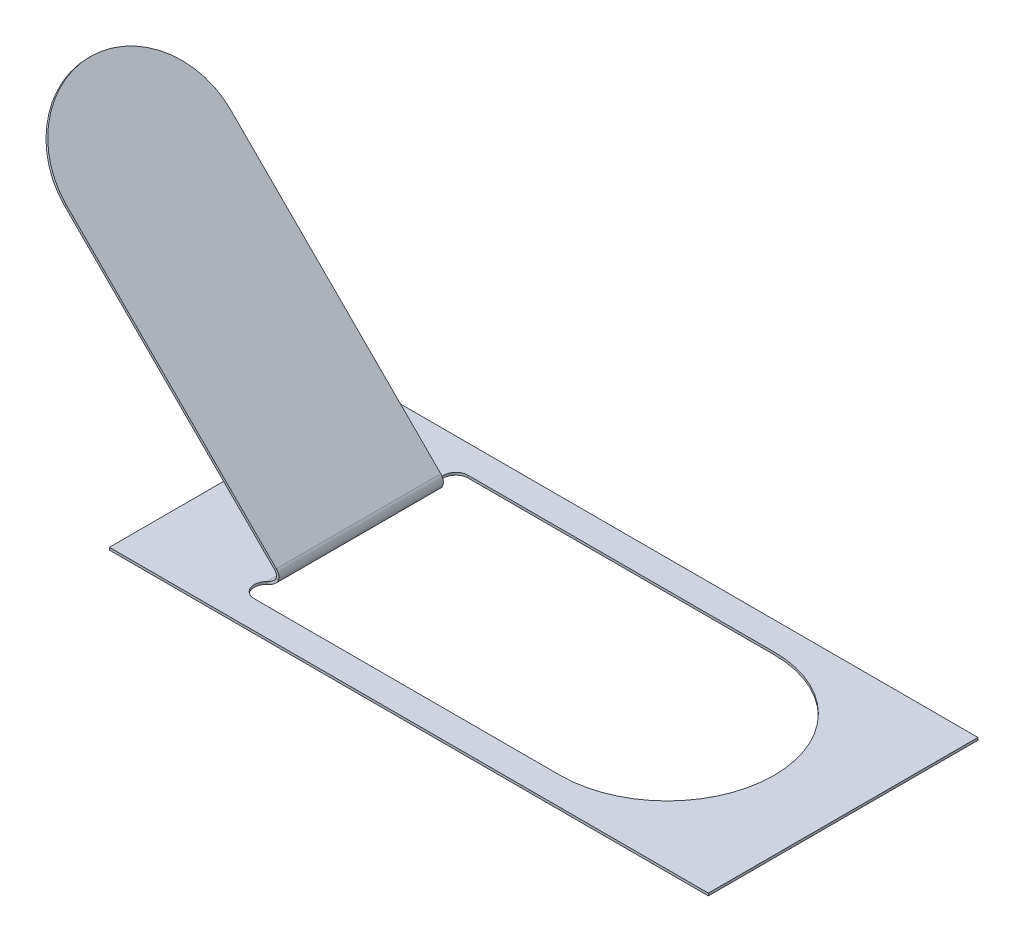
ISO-10303-21;
HEADER;
FILE_DESCRIPTION(('STEP AP214'),'2;1');
FILE_NAME('part.step','',(''),(''),'','','');
FILE_SCHEMA(('AUTOMOTIVE_DESIGN { 1 0 10303 214 1 1 1 1 }'));
ENDSEC;
DATA;
#1=APPLICATION_CONTEXT('core data for automotive mechanical design processes');
#2=APPLICATION_PROTOCOL_DEFINITION('international standard','automotive_design',2000,#1);
#3=PRODUCT_CONTEXT('',#1,'mechanical');
#4=PRODUCT('Part','Part','',(#3));
#5=PRODUCT_RELATED_PRODUCT_CATEGORY('part','',(#4));
#6=PRODUCT_DEFINITION_FORMATION('','',#4);
#7=PRODUCT_DEFINITION_CONTEXT('part definition',#1,'design');
#8=PRODUCT_DEFINITION('design','',#6,#7);
#9=PRODUCT_DEFINITION_SHAPE('','',#8);
#10=(LENGTH_UNIT() NAMED_UNIT(*) SI_UNIT(.MILLI.,.METRE.));
#11=(NAMED_UNIT(*) PLANE_ANGLE_UNIT() SI_UNIT($,.RADIAN.));
#12=(NAMED_UNIT(*) SI_UNIT($,.STERADIAN.) SOLID_ANGLE_UNIT());
#13=UNCERTAINTY_MEASURE_WITH_UNIT(LENGTH_MEASURE(1.E-05),#10,'distance_accuracy_value','');
#14=(GEOMETRIC_REPRESENTATION_CONTEXT(3) GLOBAL_UNCERTAINTY_ASSIGNED_CONTEXT((#13)) GLOBAL_UNIT_ASSIGNED_CONTEXT((#10,
#11,#12)) REPRESENTATION_CONTEXT('',''));
#15=CARTESIAN_POINT('',(0.,0.,0.));
#16=DIRECTION('',(0.,0.,1.));
#17=DIRECTION('',(1.,0.,0.));
#18=AXIS2_PLACEMENT_3D('',#15,#16,#17);
#19=CARTESIAN_POINT('',(-89.0509644783106,17.6776695296636,2.50000000000001));
#20=DIRECTION('',(0.923879532511288,-0.382683432365088,0.));
#21=DIRECTION('',(0.382683432365088,0.923879532511288,0.));
#22=AXIS2_PLACEMENT_3D('',#19,#20,#21);
#23=PLANE('',#22);
#24=DIRECTION('',(-0.382683432365088,-0.923879532511288,0.));
#25=VECTOR('',#24,1.);
#26=CARTESIAN_POINT('',(-89.0509644783106,17.6776695296636,-2.49999999999999));
#27=LINE('',#26,#25);
#28=CARTESIAN_POINT('',(-89.0509644783106,17.6776695296636,-2.49999999999999));
#29=VERTEX_POINT('',#28);
#30=CARTESIAN_POINT('',(-96.3732949486468,0.,-2.49999999999999));
#31=VERTEX_POINT('',#30);
#32=EDGE_CURVE('E134',#29,#31,#27,.T.);
#33=ORIENTED_EDGE('',*,*,#32,.T.);
#34=DIRECTION('',(0.,0.,-1.));
#35=VECTOR('',#34,1.);
#36=CARTESIAN_POINT('',(-96.3732949486468,0.,2.50000000000001));
#37=LINE('',#36,#35);
#38=CARTESIAN_POINT('',(-96.3732949486468,0.,2.50000000000001));
#39=VERTEX_POINT('',#38);
#40=EDGE_CURVE('E13',#39,#31,#37,.T.);
#41=ORIENTED_EDGE('',*,*,#40,.F.);
#42=DIRECTION('',(-0.382683432365088,-0.923879532511288,0.));
#43=VECTOR('',#42,1.);
#44=CARTESIAN_POINT('',(-89.0509644783106,17.6776695296636,2.50000000000001));
#45=LINE('',#44,#43);
#46=CARTESIAN_POINT('',(-89.0509644783106,17.6776695296636,2.50000000000001));
#47=VERTEX_POINT('',#46);
#48=EDGE_CURVE('E122',#47,#39,#45,.T.);
#49=ORIENTED_EDGE('',*,*,#48,.F.);
#50=DIRECTION('',(0.,0.,-1.));
#51=VECTOR('',#50,1.);
#52=CARTESIAN_POINT('',(-89.0509644783106,17.6776695296636,2.50000000000001));
#53=LINE('',#52,#51);
#54=EDGE_CURVE('E130',#47,#29,#53,.T.);
#55=ORIENTED_EDGE('',*,*,#54,.T.);
#56=EDGE_LOOP('',(#33,#41,#49,#55));
#57=FACE_BOUND('',#56,.T.);
#58=ADVANCED_FACE('F71',(#57),#23,.F.);
#59=CARTESIAN_POINT('',(-83.8732949486468,0.,2.50000000000001));
#60=DIRECTION('',(0.,1.,0.));
#61=DIRECTION('',(0.,0.,1.));
#62=AXIS2_PLACEMENT_3D('',#59,#60,#61);
#63=PLANE('',#62);
#64=DIRECTION('',(1.,0.,0.));
#65=VECTOR('',#64,1.);
#66=CARTESIAN_POINT('',(-83.8732949486468,0.,-2.49999999999999));
#67=LINE('',#66,#65);
#68=CARTESIAN_POINT('',(-83.8732949486468,0.,-2.49999999999999));
#69=VERTEX_POINT('',#68);
#70=EDGE_CURVE('E126',#31,#69,#67,.T.);
#71=ORIENTED_EDGE('',*,*,#70,.T.);
#72=DIRECTION('',(0.,0.,-1.));
#73=VECTOR('',#72,1.);
#74=CARTESIAN_POINT('',(-83.8732949486468,0.,2.50000000000001));
#75=LINE('',#74,#73);
#76=CARTESIAN_POINT('',(-83.8732949486468,0.,2.50000000000001));
#77=VERTEX_POINT('',#76);
#78=EDGE_CURVE('E79',#77,#69,#75,.T.);
#79=ORIENTED_EDGE('',*,*,#78,.F.);
#80=DIRECTION('',(1.,0.,0.));
#81=VECTOR('',#80,1.);
#82=CARTESIAN_POINT('',(-83.8732949486468,0.,2.50000000000001));
#83=LINE('',#82,#81);
#84=EDGE_CURVE('E117',#39,#77,#83,.T.);
#85=ORIENTED_EDGE('',*,*,#84,.F.);
#86=ORIENTED_EDGE('',*,*,#40,.T.);
#87=EDGE_LOOP('',(#71,#79,#85,#86));
#88=FACE_BOUND('',#87,.T.);
#89=ADVANCED_FACE('F125',(#88),#63,.F.);
#90=CARTESIAN_POINT('',(-80.2121297134787,8.83883476483179,2.50000000000001));
#91=DIRECTION('',(-0.923879532511288,0.382683432365087,0.));
#92=DIRECTION('',(-0.382683432365087,-0.923879532511288,0.));
#93=AXIS2_PLACEMENT_3D('',#90,#91,#92);
#94=PLANE('',#93);
#95=DIRECTION('',(0.382683432365087,0.923879532511288,0.));
#96=VECTOR('',#95,1.);
#97=CARTESIAN_POINT('',(-80.2121297134787,8.83883476483179,-2.49999999999999));
#98=LINE('',#97,#96);
#99=CARTESIAN_POINT('',(-80.2121297134787,8.83883476483179,-2.49999999999999));
#100=VERTEX_POINT('',#99);
#101=EDGE_CURVE('E104',#69,#100,#98,.T.);
#102=ORIENTED_EDGE('',*,*,#101,.T.);
#103=DIRECTION('',(0.,0.,-1.));
#104=VECTOR('',#103,1.);
#105=CARTESIAN_POINT('',(-80.2121297134787,8.83883476483179,2.50000000000001));
#106=LINE('',#105,#104);
#107=CARTESIAN_POINT('',(-80.2121297134787,8.83883476483179,2.50000000000001));
#108=VERTEX_POINT('',#107);
#109=EDGE_CURVE('E127',#108,#100,#106,.T.);
#110=ORIENTED_EDGE('',*,*,#109,.F.);
#111=DIRECTION('',(0.382683432365087,0.923879532511288,0.));
#112=VECTOR('',#111,1.);
#113=CARTESIAN_POINT('',(-80.2121297134787,8.83883476483179,2.50000000000001));
#114=LINE('',#113,#112);
#115=EDGE_CURVE('E120',#77,#108,#114,.T.);
#116=ORIENTED_EDGE('',*,*,#115,.F.);
#117=ORIENTED_EDGE('',*,*,#78,.T.);
#118=EDGE_LOOP('',(#102,#110,#116,#117));
#119=FACE_BOUND('',#118,.T.);
#120=ADVANCED_FACE('F128',(#119),#94,.F.);
#121=CARTESIAN_POINT('',(-80.2121297134787,8.83883476483179,2.50000000000001));
#122=DIRECTION('',(-0.707106781186544,-0.707106781186551,0.));
#123=DIRECTION('',(0.707106781186551,-0.707106781186544,0.));
#124=AXIS2_PLACEMENT_3D('',#121,#122,#123);
#125=PLANE('',#124);
#126=DIRECTION('',(-0.707106781186551,0.707106781186544,0.));
#127=VECTOR('',#126,1.);
#128=CARTESIAN_POINT('',(-80.2121297134787,8.83883476483179,-2.49999999999999));
#129=LINE('',#128,#127);
#130=EDGE_CURVE('E110',#100,#29,#129,.T.);
#131=ORIENTED_EDGE('',*,*,#130,.T.);
#132=ORIENTED_EDGE('',*,*,#54,.F.);
#133=DIRECTION('',(-0.707106781186551,0.707106781186544,0.));
#134=VECTOR('',#133,1.);
#135=CARTESIAN_POINT('',(-80.2121297134787,8.83883476483179,2.50000000000001));
#136=LINE('',#135,#134);
#137=EDGE_CURVE('E87',#108,#47,#136,.T.);
#138=ORIENTED_EDGE('',*,*,#137,.F.);
#139=ORIENTED_EDGE('',*,*,#109,.T.);
#140=EDGE_LOOP('',(#131,#132,#138,#139));
#141=FACE_BOUND('',#140,.T.);
#142=ADVANCED_FACE('F141',(#141),#125,.F.);
#143=CARTESIAN_POINT('',(0.,0.,2.50000000000001));
#144=DIRECTION('',(0.,0.,-1.));
#145=DIRECTION('',(-1.,0.,0.));
#146=AXIS2_PLACEMENT_3D('',#143,#144,#145);
#147=PLANE('',#146);
#148=ORIENTED_EDGE('',*,*,#48,.T.);
#149=ORIENTED_EDGE('',*,*,#84,.T.);
#150=ORIENTED_EDGE('',*,*,#115,.T.);
#151=ORIENTED_EDGE('',*,*,#137,.T.);
#152=EDGE_LOOP('',(#148,#149,#150,#151));
#153=FACE_BOUND('',#152,.T.);
#154=ADVANCED_FACE('F118',(#153),#147,.F.);
#155=CARTESIAN_POINT('',(0.,0.,-2.49999999999999));
#156=DIRECTION('',(0.,0.,-1.));
#157=DIRECTION('',(-1.,0.,0.));
#158=AXIS2_PLACEMENT_3D('',#155,#156,#157);
#159=PLANE('',#158);
#160=ORIENTED_EDGE('',*,*,#32,.F.);
#161=ORIENTED_EDGE('',*,*,#130,.F.);
#162=ORIENTED_EDGE('',*,*,#101,.F.);
#163=ORIENTED_EDGE('',*,*,#70,.F.);
#164=EDGE_LOOP('',(#160,#161,#162,#163));
#165=FACE_BOUND('',#164,.T.);
#166=ADVANCED_FACE('F144',(#165),#159,.T.);
#167=CLOSED_SHELL('',(#58,#89,#120,#142,#154,#166));
#168=MANIFOLD_SOLID_BREP('B2',#167);
#169=CARTESIAN_POINT('',(-66.0708724370337,8.83971311211782,-33.2923380798095));
#170=DIRECTION('',(0.,0.,1.));
#171=DIRECTION('',(-0.707106781186551,0.707106781186544,0.));
#172=AXIS2_PLACEMENT_3D('',#169,#170,#171);
#173=PLANE('',#172);
#174=DIRECTION('',(-0.707106781186551,0.707106781186544,0.));
#175=VECTOR('',#174,1.);
#176=CARTESIAN_POINT('',(-124.672019621781,54.7129382355066,-33.2923380798094));
#177=LINE('',#176,#175);
#178=CARTESIAN_POINT('',(-74.9339551204267,4.97487373415293,-33.2923380798095));
#179=VERTEX_POINT('',#178);
#180=CARTESIAN_POINT('',(-160.027358681108,90.0682772948338,-33.2923380798094));
#181=VERTEX_POINT('',#180);
#182=EDGE_CURVE('E198',#179,#181,#177,.T.);
#183=ORIENTED_EDGE('',*,*,#182,.F.);
#184=DIRECTION('',(-0.707106781186544,-0.707106781186551,0.));
#185=VECTOR('',#184,1.);
#186=CARTESIAN_POINT('',(-68.5699940897478,11.3388347648319,-33.2923380798095));
#187=LINE('',#186,#185);
#188=CARTESIAN_POINT('',(-75.6410619016132,4.26776695296637,-33.2923380798095));
#189=VERTEX_POINT('',#188);
#190=EDGE_CURVE('E69',#179,#189,#187,.T.);
#191=ORIENTED_EDGE('',*,*,#190,.T.);
#192=DIRECTION('',(-0.707106781186551,0.707106781186544,0.));
#193=VECTOR('',#192,1.);
#194=CARTESIAN_POINT('',(-73.1419402488991,1.76864530025231,-33.2923380798095));
#195=LINE('',#194,#193);
#196=CARTESIAN_POINT('',(-160.734465462295,89.3611705136473,-33.2923380798094));
#197=VERTEX_POINT('',#196);
#198=EDGE_CURVE('E535',#189,#197,#195,.T.);
#199=ORIENTED_EDGE('',*,*,#198,.T.);
#200=DIRECTION('',(-0.707106781186544,-0.707106781186551,0.));
#201=VECTOR('',#200,1.);
#202=CARTESIAN_POINT('',(-153.66339765043,96.4322383255128,-33.2923380798094));
#203=LINE('',#202,#201);
#204=EDGE_CURVE('E511',#181,#197,#203,.T.);
#205=ORIENTED_EDGE('',*,*,#204,.F.);
#206=EDGE_LOOP('',(#183,#191,#199,#205));
#207=FACE_BOUND('',#206,.T.);
#208=ADVANCED_FACE('F195',(#207),#173,.F.);
#209=CARTESIAN_POINT('',(-153.66339765043,96.4322383255128,33.2923380798095));
#210=DIRECTION('',(0.,0.,-1.));
#211=DIRECTION('',(0.707106781186551,-0.707106781186544,0.));
#212=AXIS2_PLACEMENT_3D('',#209,#210,#211);
#213=PLANE('',#212);
#214=DIRECTION('',(0.707106781186551,-0.707106781186544,0.));
#215=VECTOR('',#214,1.);
#216=CARTESIAN_POINT('',(-160.734465462295,89.3611705136472,33.2923380798095));
#217=LINE('',#216,#215);
#218=CARTESIAN_POINT('',(-160.734465462295,89.3611705136472,33.2923380798095));
#219=VERTEX_POINT('',#218);
#220=CARTESIAN_POINT('',(-75.6410619016132,4.26776695296637,33.2923380798095));
#221=VERTEX_POINT('',#220);
#222=EDGE_CURVE('E525',#219,#221,#217,.T.);
#223=ORIENTED_EDGE('',*,*,#222,.T.);
#224=DIRECTION('',(0.707106781186544,0.707106781186551,0.));
#225=VECTOR('',#224,1.);
#226=CARTESIAN_POINT('',(-68.5699940897478,11.3388347648319,33.2923380798095));
#227=LINE('',#226,#225);
#228=CARTESIAN_POINT('',(-74.9339551204267,4.97487373415292,33.2923380798095));
#229=VERTEX_POINT('',#228);
#230=EDGE_CURVE('E508',#221,#229,#227,.T.);
#231=ORIENTED_EDGE('',*,*,#230,.T.);
#232=DIRECTION('',(0.707106781186551,-0.707106781186544,0.));
#233=VECTOR('',#232,1.);
#234=CARTESIAN_POINT('',(-124.672019621781,54.7129382355066,33.2923380798095));
#235=LINE('',#234,#233);
#236=CARTESIAN_POINT('',(-160.027358681108,90.0682772948338,33.2923380798095));
#237=VERTEX_POINT('',#236);
#238=EDGE_CURVE('E505',#237,#229,#235,.T.);
#239=ORIENTED_EDGE('',*,*,#238,.F.);
#240=DIRECTION('',(-0.707106781186544,-0.707106781186551,0.));
#241=VECTOR('',#240,1.);
#242=CARTESIAN_POINT('',(-153.66339765043,96.4322383255128,33.2923380798095));
#243=LINE('',#242,#241);
#244=EDGE_CURVE('E515',#237,#219,#243,.T.);
#245=ORIENTED_EDGE('',*,*,#244,.T.);
#246=EDGE_LOOP('',(#223,#231,#239,#245));
#247=FACE_BOUND('',#246,.T.);
#248=ADVANCED_FACE('F561',(#247),#213,.F.);
#249=CARTESIAN_POINT('',(-124.672019621781,54.7129382355066,0.));
#250=DIRECTION('',(-0.707106781186544,-0.707106781186551,0.));
#251=DIRECTION('',(0.,0.,1.));
#252=AXIS2_PLACEMENT_3D('',#249,#250,#251);
#253=PLANE('',#252);
#254=ORIENTED_EDGE('',*,*,#238,.T.);
#255=DIRECTION('',(0.,0.,-1.));
#256=VECTOR('',#255,1.);
#257=CARTESIAN_POINT('',(-74.9339551204267,4.97487373415292,0.));
#258=LINE('',#257,#256);
#259=EDGE_CURVE('E345',#229,#179,#258,.T.);
#260=ORIENTED_EDGE('',*,*,#259,.T.);
#261=ORIENTED_EDGE('',*,*,#182,.T.);
#262=CARTESIAN_POINT('',(-160.027358681108,90.0682772948338,0.));
#263=DIRECTION('',(-0.707106781186544,-0.707106781186551,0.));
#264=DIRECTION('',(0.,0.,1.));
#265=AXIS2_PLACEMENT_3D('',#262,#263,#264);
#266=CIRCLE('',#265,33.2923380798095);
#267=EDGE_CURVE('E514',#181,#237,#266,.F.);
#268=ORIENTED_EDGE('',*,*,#267,.T.);
#269=EDGE_LOOP('',(#254,#260,#261,#268));
#270=FACE_BOUND('',#269,.T.);
#271=ADVANCED_FACE('F504',(#270),#253,.F.);
#272=CARTESIAN_POINT('',(-125.379126402967,54.0058314543201,0.));
#273=DIRECTION('',(-0.707106781186544,-0.707106781186551,0.));
#274=DIRECTION('',(0.,0.,1.));
#275=AXIS2_PLACEMENT_3D('',#272,#273,#274);
#276=PLANE('',#275);
#277=DIRECTION('',(0.,0.,-1.));
#278=VECTOR('',#277,1.);
#279=CARTESIAN_POINT('',(-75.6410619016132,4.26776695296637,0.));
#280=LINE('',#279,#278);
#281=EDGE_CURVE('E204',#221,#189,#280,.T.);
#282=ORIENTED_EDGE('',*,*,#281,.F.);
#283=ORIENTED_EDGE('',*,*,#222,.F.);
#284=CARTESIAN_POINT('',(-160.734465462295,89.3611705136472,0.));
#285=DIRECTION('',(0.707106781186544,0.707106781186551,0.));
#286=DIRECTION('',(0.,0.,-1.));
#287=AXIS2_PLACEMENT_3D('',#284,#285,#286);
#288=CIRCLE('',#287,33.2923380798095);
#289=EDGE_CURVE('E528',#197,#219,#288,.T.);
#290=ORIENTED_EDGE('',*,*,#289,.F.);
#291=ORIENTED_EDGE('',*,*,#198,.F.);
#292=EDGE_LOOP('',(#282,#283,#290,#291));
#293=FACE_BOUND('',#292,.T.);
#294=ADVANCED_FACE('F548',(#293),#276,.T.);
#295=CARTESIAN_POINT('',(-153.66339765043,96.4322383255128,0.));
#296=DIRECTION('',(-0.707106781186544,-0.707106781186551,0.));
#297=DIRECTION('',(0.,0.,1.));
#298=AXIS2_PLACEMENT_3D('',#295,#296,#297);
#299=CYLINDRICAL_SURFACE('',#298,33.2923380798095);
#300=ORIENTED_EDGE('',*,*,#204,.T.);
#301=ORIENTED_EDGE('',*,*,#289,.T.);
#302=ORIENTED_EDGE('',*,*,#244,.F.);
#303=ORIENTED_EDGE('',*,*,#267,.F.);
#304=EDGE_LOOP('',(#300,#301,#302,#303));
#305=FACE_BOUND('',#304,.T.);
#306=ADVANCED_FACE('F546',(#305),#299,.T.);
#307=CARTESIAN_POINT('',(-121.258318075826,-1.,-54.5837660124565));
#308=DIRECTION('',(0.,0.,-1.));
#309=DIRECTION('',(-1.,0.,0.));
#310=AXIS2_PLACEMENT_3D('',#307,#308,#309);
#311=PLANE('',#310);
#312=DIRECTION('',(-1.,0.,0.));
#313=VECTOR('',#312,1.);
#314=CARTESIAN_POINT('',(-121.258318075826,0.,-54.5837660124565));
#315=LINE('',#314,#313);
#316=CARTESIAN_POINT('',(121.258318075826,0.,-54.5837660124565));
#317=VERTEX_POINT('',#316);
#318=CARTESIAN_POINT('',(-121.258318075826,0.,-54.5837660124565));
#319=VERTEX_POINT('',#318);
#320=EDGE_CURVE('E741',#317,#319,#315,.T.);
#321=ORIENTED_EDGE('',*,*,#320,.F.);
#322=DIRECTION('',(0.,1.,0.));
#323=VECTOR('',#322,1.);
#324=CARTESIAN_POINT('',(121.258318075826,-1.,-54.5837660124565));
#325=LINE('',#324,#323);
#326=CARTESIAN_POINT('',(121.258318075826,-1.,-54.5837660124565));
#327=VERTEX_POINT('',#326);
#328=EDGE_CURVE('E633',#327,#317,#325,.T.);
#329=ORIENTED_EDGE('',*,*,#328,.F.);
#330=DIRECTION('',(-1.,0.,0.));
#331=VECTOR('',#330,1.);
#332=CARTESIAN_POINT('',(-121.258318075826,-1.,-54.5837660124565));
#333=LINE('',#332,#331);
#334=CARTESIAN_POINT('',(-121.258318075826,-1.,-54.5837660124565));
#335=VERTEX_POINT('',#334);
#336=EDGE_CURVE('E657',#327,#335,#333,.T.);
#337=ORIENTED_EDGE('',*,*,#336,.T.);
#338=DIRECTION('',(0.,1.,0.));
#339=VECTOR('',#338,1.);
#340=CARTESIAN_POINT('',(-121.258318075826,-1.,-54.5837660124565));
#341=LINE('',#340,#339);
#342=EDGE_CURVE('E654',#335,#319,#341,.T.);
#343=ORIENTED_EDGE('',*,*,#342,.T.);
#344=EDGE_LOOP('',(#321,#329,#337,#343));
#345=FACE_BOUND('',#344,.T.);
#346=ADVANCED_FACE('F559',(#345),#311,.T.);
#347=CARTESIAN_POINT('',(-121.258318075826,-1.,-54.5837660124565));
#348=DIRECTION('',(-1.,0.,0.));
#349=DIRECTION('',(0.,0.,1.));
#350=AXIS2_PLACEMENT_3D('',#347,#348,#349);
#351=PLANE('',#350);
#352=DIRECTION('',(0.,0.,1.));
#353=VECTOR('',#352,1.);
#354=CARTESIAN_POINT('',(-121.258318075826,0.,-54.5837660124565));
#355=LINE('',#354,#353);
#356=CARTESIAN_POINT('',(-121.258318075826,0.,54.5837660124565));
#357=VERTEX_POINT('',#356);
#358=EDGE_CURVE('E738',#319,#357,#355,.T.);
#359=ORIENTED_EDGE('',*,*,#358,.F.);
#360=ORIENTED_EDGE('',*,*,#342,.F.);
#361=DIRECTION('',(0.,0.,1.));
#362=VECTOR('',#361,1.);
#363=CARTESIAN_POINT('',(-121.258318075826,-1.,-54.5837660124565));
#364=LINE('',#363,#362);
#365=CARTESIAN_POINT('',(-121.258318075826,-1.,54.5837660124565));
#366=VERTEX_POINT('',#365);
#367=EDGE_CURVE('E650',#335,#366,#364,.T.);
#368=ORIENTED_EDGE('',*,*,#367,.T.);
#369=DIRECTION('',(0.,1.,0.));
#370=VECTOR('',#369,1.);
#371=CARTESIAN_POINT('',(-121.258318075826,-1.,54.5837660124565));
#372=LINE('',#371,#370);
#373=EDGE_CURVE('E647',#366,#357,#372,.T.);
#374=ORIENTED_EDGE('',*,*,#373,.T.);
#375=EDGE_LOOP('',(#359,#360,#368,#374));
#376=FACE_BOUND('',#375,.T.);
#377=ADVANCED_FACE('F706',(#376),#351,.T.);
#378=CARTESIAN_POINT('',(-121.258318075826,-1.,54.5837660124565));
#379=DIRECTION('',(0.,0.,1.));
#380=DIRECTION('',(1.,0.,0.));
#381=AXIS2_PLACEMENT_3D('',#378,#379,#380);
#382=PLANE('',#381);
#383=DIRECTION('',(1.,0.,0.));
#384=VECTOR('',#383,1.);
#385=CARTESIAN_POINT('',(-121.258318075826,0.,54.5837660124565));
#386=LINE('',#385,#384);
#387=CARTESIAN_POINT('',(121.258318075826,0.,54.5837660124565));
#388=VERTEX_POINT('',#387);
#389=EDGE_CURVE('E734',#357,#388,#386,.T.);
#390=ORIENTED_EDGE('',*,*,#389,.F.);
#391=ORIENTED_EDGE('',*,*,#373,.F.);
#392=DIRECTION('',(1.,0.,0.));
#393=VECTOR('',#392,1.);
#394=CARTESIAN_POINT('',(-121.258318075826,-1.,54.5837660124565));
#395=LINE('',#394,#393);
#396=CARTESIAN_POINT('',(121.258318075826,-1.,54.5837660124565));
#397=VERTEX_POINT('',#396);
#398=EDGE_CURVE('E643',#366,#397,#395,.T.);
#399=ORIENTED_EDGE('',*,*,#398,.T.);
#400=DIRECTION('',(0.,1.,0.));
#401=VECTOR('',#400,1.);
#402=CARTESIAN_POINT('',(121.258318075826,-1.,54.5837660124565));
#403=LINE('',#402,#401);
#404=EDGE_CURVE('E640',#397,#388,#403,.T.);
#405=ORIENTED_EDGE('',*,*,#404,.T.);
#406=EDGE_LOOP('',(#390,#391,#399,#405));
#407=FACE_BOUND('',#406,.T.);
#408=ADVANCED_FACE('F702',(#407),#382,.T.);
#409=CARTESIAN_POINT('',(121.258318075826,-1.,-54.5837660124565));
#410=DIRECTION('',(1.,0.,0.));
#411=DIRECTION('',(0.,0.,-1.));
#412=AXIS2_PLACEMENT_3D('',#409,#410,#411);
#413=PLANE('',#412);
#414=DIRECTION('',(0.,0.,-1.));
#415=VECTOR('',#414,1.);
#416=CARTESIAN_POINT('',(121.258318075826,0.,-54.5837660124565));
#417=LINE('',#416,#415);
#418=EDGE_CURVE('E596',#388,#317,#417,.T.);
#419=ORIENTED_EDGE('',*,*,#418,.F.);
#420=ORIENTED_EDGE('',*,*,#404,.F.);
#421=DIRECTION('',(0.,0.,-1.));
#422=VECTOR('',#421,1.);
#423=CARTESIAN_POINT('',(121.258318075826,-1.,-54.5837660124565));
#424=LINE('',#423,#422);
#425=EDGE_CURVE('E636',#397,#327,#424,.T.);
#426=ORIENTED_EDGE('',*,*,#425,.T.);
#427=ORIENTED_EDGE('',*,*,#328,.T.);
#428=EDGE_LOOP('',(#419,#420,#426,#427));
#429=FACE_BOUND('',#428,.T.);
#430=ADVANCED_FACE('F698',(#429),#413,.T.);
#431=CARTESIAN_POINT('',(-73.874537119291,-10.,-43.2923380798095));
#432=DIRECTION('',(0.,0.,-1.));
#433=DIRECTION('',(-1.,0.,0.));
#434=AXIS2_PLACEMENT_3D('',#431,#432,#433);
#435=PLANE('',#434);
#436=DIRECTION('',(0.,1.,0.));
#437=VECTOR('',#436,1.);
#438=CARTESIAN_POINT('',(50.,-10.,-43.2923380798095));
#439=LINE('',#438,#437);
#440=CARTESIAN_POINT('',(50.,-0.999999999999999,-43.2923380798095));
#441=VERTEX_POINT('',#440);
#442=CARTESIAN_POINT('',(50.,0.,-43.2923380798095));
#443=VERTEX_POINT('',#442);
#444=EDGE_CURVE('E630',#441,#443,#439,.T.);
#445=ORIENTED_EDGE('',*,*,#444,.T.);
#446=DIRECTION('',(-1.,0.,0.));
#447=VECTOR('',#446,1.);
#448=CARTESIAN_POINT('',(-73.874537119291,0.,-43.2923380798095));
#449=LINE('',#448,#447);
#450=CARTESIAN_POINT('',(-73.874537119291,0.,-43.2923380798095));
#451=VERTEX_POINT('',#450);
#452=EDGE_CURVE('E626',#443,#451,#449,.T.);
#453=ORIENTED_EDGE('',*,*,#452,.T.);
#454=DIRECTION('',(0.,1.,0.));
#455=VECTOR('',#454,1.);
#456=CARTESIAN_POINT('',(-73.874537119291,-10.,-43.2923380798095));
#457=LINE('',#456,#455);
#458=CARTESIAN_POINT('',(-73.874537119291,-0.999999999999999,-43.2923380798095));
#459=VERTEX_POINT('',#458);
#460=EDGE_CURVE('E726',#459,#451,#457,.T.);
#461=ORIENTED_EDGE('',*,*,#460,.F.);
#462=DIRECTION('',(-1.,0.,0.));
#463=VECTOR('',#462,1.);
#464=CARTESIAN_POINT('',(0.,-1.,-43.2923380798095));
#465=LINE('',#464,#463);
#466=EDGE_CURVE('E590',#441,#459,#465,.T.);
#467=ORIENTED_EDGE('',*,*,#466,.F.);
#468=EDGE_LOOP('',(#445,#453,#461,#467));
#469=FACE_BOUND('',#468,.T.);
#470=ADVANCED_FACE('F694',(#469),#435,.F.);
#471=CARTESIAN_POINT('',(50.,-10.,0.));
#472=DIRECTION('',(0.,1.,0.));
#473=DIRECTION('',(0.,0.,1.));
#474=AXIS2_PLACEMENT_3D('',#471,#472,#473);
#475=CYLINDRICAL_SURFACE('',#474,43.2923380798095);
#476=DIRECTION('',(0.,1.,0.));
#477=VECTOR('',#476,1.);
#478=CARTESIAN_POINT('',(50.,-10.,43.2923380798095));
#479=LINE('',#478,#477);
#480=CARTESIAN_POINT('',(50.,-0.999999999999999,43.2923380798095));
#481=VERTEX_POINT('',#480);
#482=CARTESIAN_POINT('',(50.,0.,43.2923380798095));
#483=VERTEX_POINT('',#482);
#484=EDGE_CURVE('E623',#481,#483,#479,.T.);
#485=ORIENTED_EDGE('',*,*,#484,.T.);
#486=CARTESIAN_POINT('',(50.,0.,0.));
#487=DIRECTION('',(0.,1.,0.));
#488=DIRECTION('',(0.,0.,-1.));
#489=AXIS2_PLACEMENT_3D('',#486,#487,#488);
#490=CIRCLE('',#489,43.2923380798095);
#491=EDGE_CURVE('E619',#483,#443,#490,.T.);
#492=ORIENTED_EDGE('',*,*,#491,.T.);
#493=ORIENTED_EDGE('',*,*,#444,.F.);
#494=CARTESIAN_POINT('',(50.,-0.999999999999999,0.));
#495=DIRECTION('',(0.,1.,0.));
#496=DIRECTION('',(0.,0.,1.));
#497=AXIS2_PLACEMENT_3D('',#494,#495,#496);
#498=CIRCLE('',#497,43.2923380798095);
#499=EDGE_CURVE('E598',#481,#441,#498,.T.);
#500=ORIENTED_EDGE('',*,*,#499,.F.);
#501=EDGE_LOOP('',(#485,#492,#493,#500));
#502=FACE_BOUND('',#501,.T.);
#503=ADVANCED_FACE('F690',(#502),#475,.F.);
#504=CARTESIAN_POINT('',(50.,-10.,43.2923380798095));
#505=DIRECTION('',(0.,0.,1.));
#506=DIRECTION('',(1.,0.,0.));
#507=AXIS2_PLACEMENT_3D('',#504,#505,#506);
#508=PLANE('',#507);
#509=DIRECTION('',(0.,1.,0.));
#510=VECTOR('',#509,1.);
#511=CARTESIAN_POINT('',(-73.874537119291,-10.,43.2923380798095));
#512=LINE('',#511,#510);
#513=CARTESIAN_POINT('',(-73.874537119291,-0.999999999999999,43.2923380798095));
#514=VERTEX_POINT('',#513);
#515=CARTESIAN_POINT('',(-73.874537119291,0.,43.2923380798095));
#516=VERTEX_POINT('',#515);
#517=EDGE_CURVE('E615',#514,#516,#512,.T.);
#518=ORIENTED_EDGE('',*,*,#517,.T.);
#519=DIRECTION('',(1.,0.,0.));
#520=VECTOR('',#519,1.);
#521=CARTESIAN_POINT('',(50.,0.,43.2923380798095));
#522=LINE('',#521,#520);
#523=EDGE_CURVE('E611',#516,#483,#522,.T.);
#524=ORIENTED_EDGE('',*,*,#523,.T.);
#525=ORIENTED_EDGE('',*,*,#484,.F.);
#526=DIRECTION('',(1.,0.,0.));
#527=VECTOR('',#526,1.);
#528=CARTESIAN_POINT('',(0.,-1.,43.2923380798095));
#529=LINE('',#528,#527);
#530=EDGE_CURVE('E602',#514,#481,#529,.T.);
#531=ORIENTED_EDGE('',*,*,#530,.F.);
#532=EDGE_LOOP('',(#518,#524,#525,#531));
#533=FACE_BOUND('',#532,.T.);
#534=ADVANCED_FACE('F687',(#533),#508,.F.);
#535=CARTESIAN_POINT('',(0.,-1.,0.));
#536=DIRECTION('',(0.,1.,0.));
#537=DIRECTION('',(0.,0.,1.));
#538=AXIS2_PLACEMENT_3D('',#535,#536,#537);
#539=PLANE('',#538);
#540=CARTESIAN_POINT('',(-103.908126203578,-1.,-31.7462982092991));
#541=DIRECTION('',(0.,1.,0.));
#542=DIRECTION('',(0.,0.,1.));
#543=AXIS2_PLACEMENT_3D('',#540,#541,#542);
#544=CIRCLE('',#543,5.);
#545=CARTESIAN_POINT('',(-103.908126203578,-1.,-26.7462982092991));
#546=VERTEX_POINT('',#545);
#547=EDGE_CURVE('E477',#546,#546,#544,.T.);
#548=ORIENTED_EDGE('',*,*,#547,.T.);
#549=EDGE_LOOP('',(#548));
#550=FACE_BOUND('',#549,.T.);
#551=DIRECTION('',(0.,0.,-1.));
#552=VECTOR('',#551,1.);
#553=CARTESIAN_POINT('',(-77.4088288545796,-1.,0.));
#554=LINE('',#553,#552);
#555=CARTESIAN_POINT('',(-77.4088288545796,-1.,34.7555624395022));
#556=VERTEX_POINT('',#555);
#557=CARTESIAN_POINT('',(-77.4088288545796,-0.999999999999999,-34.7555624395021));
#558=VERTEX_POINT('',#557);
#559=EDGE_CURVE('E326',#556,#558,#554,.T.);
#560=ORIENTED_EDGE('',*,*,#559,.F.);
#561=CARTESIAN_POINT('',(-73.874537119291,-0.999999999999999,38.2923380798095));
#562=DIRECTION('',(0.,1.,0.));
#563=DIRECTION('',(0.,0.,1.));
#564=AXIS2_PLACEMENT_3D('',#561,#562,#563);
#565=CIRCLE('',#564,5.);
#566=EDGE_CURVE('E610',#556,#514,#565,.T.);
#567=ORIENTED_EDGE('',*,*,#566,.T.);
#568=ORIENTED_EDGE('',*,*,#530,.T.);
#569=ORIENTED_EDGE('',*,*,#499,.T.);
#570=ORIENTED_EDGE('',*,*,#466,.T.);
#571=CARTESIAN_POINT('',(-73.874537119291,-0.999999999999999,-38.2923380798095));
#572=DIRECTION('',(0.,1.,0.));
#573=DIRECTION('',(0.,0.,1.));
#574=AXIS2_PLACEMENT_3D('',#571,#572,#573);
#575=CIRCLE('',#574,5.);
#576=EDGE_CURVE('E582',#459,#558,#575,.T.);
#577=ORIENTED_EDGE('',*,*,#576,.T.);
#578=EDGE_LOOP('',(#560,#567,#568,#569,#570,#577));
#579=FACE_BOUND('',#578,.T.);
#580=ORIENTED_EDGE('',*,*,#425,.F.);
#581=ORIENTED_EDGE('',*,*,#398,.F.);
#582=ORIENTED_EDGE('',*,*,#367,.F.);
#583=ORIENTED_EDGE('',*,*,#336,.F.);
#584=EDGE_LOOP('',(#580,#581,#582,#583));
#585=FACE_BOUND('',#584,.T.);
#586=ADVANCED_FACE('F684',(#550,#579,#585),#539,.F.);
#587=CARTESIAN_POINT('',(-73.874537119291,-10.,38.2923380798095));
#588=DIRECTION('',(0.,1.,0.));
#589=DIRECTION('',(0.,0.,1.));
#590=AXIS2_PLACEMENT_3D('',#587,#588,#589);
#591=CYLINDRICAL_SURFACE('',#590,5.);
#592=CARTESIAN_POINT('',(-77.4088288545796,0.,34.7555624395022));
#593=CARTESIAN_POINT('',(-77.4088288545796,-1.,34.7555624395022));
#594=B_SPLINE_CURVE_WITH_KNOTS('',1,(#592,#593),.UNSPECIFIED.,.F.,.F.,(2,2),(0.,1.),.UNSPECIFIED.);
#595=CARTESIAN_POINT('',(-77.4088288545796,0.,34.7555624395022));
#596=VERTEX_POINT('',#595);
#597=EDGE_CURVE('E336',#596,#556,#594,.T.);
#598=ORIENTED_EDGE('',*,*,#597,.F.);
#599=CARTESIAN_POINT('',(-73.874537119291,0.,38.2923380798095));
#600=DIRECTION('',(0.,1.,0.));
#601=DIRECTION('',(0.,0.,1.));
#602=AXIS2_PLACEMENT_3D('',#599,#600,#601);
#603=CIRCLE('',#602,5.);
#604=EDGE_CURVE('E589',#596,#516,#603,.T.);
#605=ORIENTED_EDGE('',*,*,#604,.T.);
#606=ORIENTED_EDGE('',*,*,#517,.F.);
#607=ORIENTED_EDGE('',*,*,#566,.F.);
#608=EDGE_LOOP('',(#598,#605,#606,#607));
#609=FACE_BOUND('',#608,.T.);
#610=ADVANCED_FACE('F675',(#609),#591,.F.);
#611=CARTESIAN_POINT('',(0.,0.,0.));
#612=DIRECTION('',(0.,1.,0.));
#613=DIRECTION('',(0.,0.,1.));
#614=AXIS2_PLACEMENT_3D('',#611,#612,#613);
#615=PLANE('',#614);
#616=CARTESIAN_POINT('',(-103.908126203578,0.,-31.7462982092991));
#617=DIRECTION('',(0.,1.,0.));
#618=DIRECTION('',(0.,0.,1.));
#619=AXIS2_PLACEMENT_3D('',#616,#617,#618);
#620=CIRCLE('',#619,5.);
#621=CARTESIAN_POINT('',(-103.908126203578,0.,-26.7462982092991));
#622=VERTEX_POINT('',#621);
#623=EDGE_CURVE('E481',#622,#622,#620,.T.);
#624=ORIENTED_EDGE('',*,*,#623,.F.);
#625=EDGE_LOOP('',(#624));
#626=FACE_BOUND('',#625,.T.);
#627=ORIENTED_EDGE('',*,*,#418,.T.);
#628=ORIENTED_EDGE('',*,*,#320,.T.);
#629=ORIENTED_EDGE('',*,*,#358,.T.);
#630=ORIENTED_EDGE('',*,*,#389,.T.);
#631=EDGE_LOOP('',(#627,#628,#629,#630));
#632=FACE_BOUND('',#631,.T.);
#633=ORIENTED_EDGE('',*,*,#604,.F.);
#634=DIRECTION('',(0.,0.,-1.));
#635=VECTOR('',#634,1.);
#636=CARTESIAN_POINT('',(-77.4088288545796,0.,0.));
#637=LINE('',#636,#635);
#638=CARTESIAN_POINT('',(-77.4088288545796,0.,-34.7555624395021));
#639=VERTEX_POINT('',#638);
#640=EDGE_CURVE('E471',#596,#639,#637,.T.);
#641=ORIENTED_EDGE('',*,*,#640,.T.);
#642=CARTESIAN_POINT('',(-73.874537119291,0.,-38.2923380798095));
#643=DIRECTION('',(0.,1.,0.));
#644=DIRECTION('',(0.,0.,1.));
#645=AXIS2_PLACEMENT_3D('',#642,#643,#644);
#646=CIRCLE('',#645,5.);
#647=EDGE_CURVE('E538',#451,#639,#646,.T.);
#648=ORIENTED_EDGE('',*,*,#647,.F.);
#649=ORIENTED_EDGE('',*,*,#452,.F.);
#650=ORIENTED_EDGE('',*,*,#491,.F.);
#651=ORIENTED_EDGE('',*,*,#523,.F.);
#652=EDGE_LOOP('',(#633,#641,#648,#649,#650,#651));
#653=FACE_BOUND('',#652,.T.);
#654=ADVANCED_FACE('F575',(#626,#632,#653),#615,.T.);
#655=CARTESIAN_POINT('',(-73.874537119291,-10.,-38.2923380798095));
#656=DIRECTION('',(0.,1.,0.));
#657=DIRECTION('',(0.,0.,1.));
#658=AXIS2_PLACEMENT_3D('',#655,#656,#657);
#659=CYLINDRICAL_SURFACE('',#658,5.);
#660=CARTESIAN_POINT('',(-77.4088288545796,-1.,-34.7555624395022));
#661=CARTESIAN_POINT('',(-77.4088288545796,0.,-34.7555624395022));
#662=B_SPLINE_CURVE_WITH_KNOTS('',1,(#660,#661),.UNSPECIFIED.,.F.,.F.,(2,2),(0.,1.),.UNSPECIFIED.);
#663=EDGE_CURVE('E451',#558,#639,#662,.T.);
#664=ORIENTED_EDGE('',*,*,#663,.F.);
#665=ORIENTED_EDGE('',*,*,#576,.F.);
#666=ORIENTED_EDGE('',*,*,#460,.T.);
#667=ORIENTED_EDGE('',*,*,#647,.T.);
#668=EDGE_LOOP('',(#664,#665,#666,#667));
#669=FACE_BOUND('',#668,.T.);
#670=ADVANCED_FACE('F571',(#669),#659,.F.);
#671=CARTESIAN_POINT('',(-74.1752504907901,1.16060798672221,33.2923380798095));
#672=CARTESIAN_POINT('',(-74.3603455106542,0.71374907943857,33.3271651971872));
#673=CARTESIAN_POINT('',(-74.6117223645254,0.364564155334345,33.3744751904507));
#674=CARTESIAN_POINT('',(-74.9883410472888,-0.0347014647889654,33.4646107259784));
#675=CARTESIAN_POINT('',(-75.1141725495288,-0.147305210792834,33.4978262047706));
#676=CARTESIAN_POINT('',(-75.2950360841301,-0.290662687059386,33.5524048733833));
#677=CARTESIAN_POINT('',(-75.3540402837923,-0.334201077149204,33.5713903379916));
#678=CARTESIAN_POINT('',(-75.4398340057044,-0.393833485048999,33.6010573975102));
#679=CARTESIAN_POINT('',(-75.4679814648186,-0.412765180834071,33.6111445611175));
#680=CARTESIAN_POINT('',(-75.5094426841729,-0.439830704806531,33.6265725221798));
#681=CARTESIAN_POINT('',(-75.5231365229058,-0.448630534160907,33.6317647118092));
#682=CARTESIAN_POINT('',(-75.5434777127093,-0.461507980185655,33.6396273001661));
#683=CARTESIAN_POINT('',(-75.5502248534949,-0.465746744922938,33.6422605469373));
#684=CARTESIAN_POINT('',(-75.563651069771,-0.474118614029659,33.6475518084505));
#685=CARTESIAN_POINT('',(-75.5694935013164,-0.477737822086316,33.6498735684786));
#686=CARTESIAN_POINT('',(-75.8163642398923,-0.629374568561031,33.7490931320489));
#687=CARTESIAN_POINT('',(-76.0912596228578,-0.758412632347789,33.8890897719118));
#688=CARTESIAN_POINT('',(-76.7065500364381,-0.943841753712459,34.2566505111058));
#689=CARTESIAN_POINT('',(-77.0469349084803,-0.999999999999999,34.4840555344198));
#690=CARTESIAN_POINT('',(-77.4088288545796,-1.,34.7555624395022));
#691=CARTESIAN_POINT('',(-75.0991300233013,1.54329141908729,33.2923380798095));
#692=CARTESIAN_POINT('',(-75.2313388969535,1.22411096325009,33.3271647085876));
#693=CARTESIAN_POINT('',(-75.410895647398,0.974688682381676,33.3744751904507));
#694=CARTESIAN_POINT('',(-75.679908992229,0.689498953722169,33.4646107259784));
#695=CARTESIAN_POINT('',(-75.7697886366862,0.609067706576547,33.4978262047706));
#696=CARTESIAN_POINT('',(-75.8989768756871,0.506669509243296,33.5524048733833));
#697=CARTESIAN_POINT('',(-75.9411227325886,0.47557065917914,33.5713903379916));
#698=CARTESIAN_POINT('',(-76.0024039625258,0.432976082107859,33.6010573975102));
#699=CARTESIAN_POINT('',(-76.0225092904646,0.419453442261378,33.6111445611175));
#700=CARTESIAN_POINT('',(-76.0521244471462,0.400120925138192,33.6265725221798));
#701=CARTESIAN_POINT('',(-76.0619057605269,0.39383533274221,33.6317647118092));
#702=CARTESIAN_POINT('',(-76.0764351818151,0.384637157010247,33.6396273001661));
#703=CARTESIAN_POINT('',(-76.0812545680905,0.381609467912189,33.6422605469373));
#704=CARTESIAN_POINT('',(-76.0908447225734,0.375629561407388,33.6475518084505));
#705=CARTESIAN_POINT('',(-76.095017887963,0.373044412795489,33.6498735684786));
#706=CARTESIAN_POINT('',(-76.2713541298029,0.264732451027835,33.7490931320489));
#707=CARTESIAN_POINT('',(-76.4677079747783,0.172562405465867,33.8890897719118));
#708=CARTESIAN_POINT('',(-76.9072011273357,0.0401130330625303,34.2566505111058));
#709=CARTESIAN_POINT('',(-77.1503720892576,0.,34.4840964034185));
#710=CARTESIAN_POINT('',(-77.4088288545796,0.,34.7555624395022));
#711=B_SPLINE_SURFACE_WITH_KNOTS('',1,3,((#671,#672,#673,#674,#675,#676,#677,#678,#679,#680,
#681,#682,#683,#684,#685,#686,#687,#688,#689,#690),(#691,#692,#693,#694,#695,#696,#697,#698,
#699,#700,#701,#702,#703,#704,#705,#706,#707,#708,#709,#710)),.UNSPECIFIED.,.F.,.F.,.F.,(2,2),
(4,2,2,2,2,2,2,2,2,4),(0.,1.),(0.,0.25,0.375,0.4375,0.46875,0.484375,0.4921875,0.5,0.75,1.),.UNSPECIFIED.);
#712=CARTESIAN_POINT('',(-74.1752504907901,1.16060798672221,33.2923380798095));
#713=CARTESIAN_POINT('',(-75.0991300233013,1.54329141908729,33.2923380798095));
#714=B_SPLINE_CURVE_WITH_KNOTS('',1,(#712,#713),.UNSPECIFIED.,.F.,.F.,(2,2),(0.,1.),.UNSPECIFIED.);
#715=CARTESIAN_POINT('',(-75.0991300233013,1.54329141908729,33.2923380798095));
#716=VERTEX_POINT('',#715);
#717=CARTESIAN_POINT('',(-74.1752504907901,1.16060798672221,33.2923380798095));
#718=VERTEX_POINT('',#717);
#719=EDGE_CURVE('E312',#716,#718,#714,.F.);
#720=CARTESIAN_POINT('',(-75.0991300233013,1.54329141908729,33.2923380798095));
#721=CARTESIAN_POINT('',(-75.2313388969535,1.22411096325009,33.3271647085876));
#722=CARTESIAN_POINT('',(-75.410895647398,0.974688682381676,33.3744751904507));
#723=CARTESIAN_POINT('',(-75.679908992229,0.689498953722169,33.4646107259784));
#724=CARTESIAN_POINT('',(-75.7697886366862,0.609067706576547,33.4978262047706));
#725=CARTESIAN_POINT('',(-75.8989768756871,0.506669509243296,33.5524048733833));
#726=CARTESIAN_POINT('',(-75.9411227325886,0.47557065917914,33.5713903379916));
#727=CARTESIAN_POINT('',(-76.0024039625258,0.432976082107859,33.6010573975102));
#728=CARTESIAN_POINT('',(-76.0225092904646,0.419453442261378,33.6111445611175));
#729=CARTESIAN_POINT('',(-76.0521244471462,0.400120925138192,33.6265725221798));
#730=CARTESIAN_POINT('',(-76.0619057605269,0.39383533274221,33.6317647118092));
#731=CARTESIAN_POINT('',(-76.0764351818151,0.384637157010247,33.6396273001661));
#732=CARTESIAN_POINT('',(-76.0812545680905,0.381609467912189,33.6422605469373));
#733=CARTESIAN_POINT('',(-76.0908447225734,0.375629561407388,33.6475518084505));
#734=CARTESIAN_POINT('',(-76.095017887963,0.373044412795489,33.6498735684786));
#735=CARTESIAN_POINT('',(-76.2713541298029,0.264732451027835,33.7490931320489));
#736=CARTESIAN_POINT('',(-76.4677079747783,0.172562405465867,33.8890897719118));
#737=CARTESIAN_POINT('',(-76.9072011273357,0.0401130330625303,34.2566505111058));
#738=CARTESIAN_POINT('',(-77.1503720892576,0.,34.4840964034185));
#739=CARTESIAN_POINT('',(-77.4088288545796,0.,34.7555624395022));
#740=B_SPLINE_CURVE_WITH_KNOTS('',3,(#720,#721,#722,#723,#724,#725,#726,#727,#728,#729,#730,
#731,#732,#733,#734,#735,#736,#737,#738,#739),.UNSPECIFIED.,.F.,.F.,(4,2,2,2,2,2,2,2,2,4),(0.,
0.25,0.375,0.4375,0.46875,0.484375,0.4921875,0.5,0.75,1.),.UNSPECIFIED.);
#741=EDGE_CURVE('E358',#716,#596,#740,.T.);
#742=CARTESIAN_POINT('',(-77.4088288545796,-1.,34.7555624395022));
#743=CARTESIAN_POINT('',(-77.0469349084803,-0.999999999999999,34.4840555344198));
#744=CARTESIAN_POINT('',(-76.7065500364381,-0.943841753712459,34.2566505111058));
#745=CARTESIAN_POINT('',(-76.0912596228578,-0.758412632347789,33.8890897719118));
#746=CARTESIAN_POINT('',(-75.8163642398923,-0.629374568561031,33.7490931320489));
#747=CARTESIAN_POINT('',(-75.5694935013164,-0.477737822086316,33.6498735684786));
#748=CARTESIAN_POINT('',(-75.563651069771,-0.474118614029659,33.6475518084505));
#749=CARTESIAN_POINT('',(-75.5502248534949,-0.465746744922938,33.6422605469373));
#750=CARTESIAN_POINT('',(-75.5434777127093,-0.461507980185655,33.6396273001661));
#751=CARTESIAN_POINT('',(-75.5231365229058,-0.448630534160907,33.6317647118092));
#752=CARTESIAN_POINT('',(-75.5094426841729,-0.439830704806531,33.6265725221798));
#753=CARTESIAN_POINT('',(-75.4679814648186,-0.412765180834071,33.6111445611175));
#754=CARTESIAN_POINT('',(-75.4398340057044,-0.393833485048999,33.6010573975102));
#755=CARTESIAN_POINT('',(-75.3540402837923,-0.334201077149204,33.5713903379916));
#756=CARTESIAN_POINT('',(-75.2950360841301,-0.290662687059386,33.5524048733833));
#757=CARTESIAN_POINT('',(-75.1141725495288,-0.147305210792834,33.4978262047706));
#758=CARTESIAN_POINT('',(-74.9883410472888,-0.0347014647889654,33.4646107259784));
#759=CARTESIAN_POINT('',(-74.6117223645254,0.364564155334345,33.3744751904507));
#760=CARTESIAN_POINT('',(-74.3603455106542,0.71374907943857,33.3271651971872));
#761=CARTESIAN_POINT('',(-74.1752504907901,1.16060798672221,33.2923380798095));
#762=B_SPLINE_CURVE_WITH_KNOTS('',3,(#742,#743,#744,#745,#746,#747,#748,#749,#750,#751,#752,
#753,#754,#755,#756,#757,#758,#759,#760,#761),.UNSPECIFIED.,.F.,.F.,(4,2,2,2,2,2,2,2,2,4),(0.,
0.25,0.5,0.5078125,0.515625,0.53125,0.5625,0.625,0.75,1.),.UNSPECIFIED.);
#763=EDGE_CURVE('E332',#718,#556,#762,.F.);
#764=ORIENTED_EDGE('',*,*,#719,.F.);
#765=ORIENTED_EDGE('',*,*,#741,.T.);
#766=ORIENTED_EDGE('',*,*,#597,.T.);
#767=ORIENTED_EDGE('',*,*,#763,.F.);
#768=EDGE_LOOP('',(#764,#765,#766,#767));
#769=FACE_BOUND('',#768,.T.);
#770=ADVANCED_FACE('F334',(#769),#711,.T.);
#771=CARTESIAN_POINT('',(-77.4088288545796,-1.,-34.7555624395022));
#772=CARTESIAN_POINT('',(-77.0221940261625,-0.999999999999999,-34.4767798892043));
#773=CARTESIAN_POINT('',(-76.6702320605327,-0.936247579831329,-34.2457243316428));
#774=CARTESIAN_POINT('',(-76.2100826057098,-0.792239070046243,-33.9695518989148));
#775=CARTESIAN_POINT('',(-76.0678017938935,-0.736128836790454,-33.8892951044683));
#776=CARTESIAN_POINT('',(-75.8711421902154,-0.644954781660009,-33.7866109374931));
#777=CARTESIAN_POINT('',(-75.8083710443307,-0.613388267914674,-33.755333052617));
#778=CARTESIAN_POINT('',(-75.7183123775823,-0.564851867267714,-33.7128414814766));
#779=CARTESIAN_POINT('',(-75.6889752986209,-0.548474800376559,-33.6994151671254));
#780=CARTESIAN_POINT('',(-75.645979676002,-0.523679296685899,-33.680382009642));
#781=CARTESIAN_POINT('',(-75.631816106707,-0.515375779869995,-33.6742220094881));
#782=CARTESIAN_POINT('',(-75.6038229765939,-0.498702916323224,-33.6622707805281));
#783=CARTESIAN_POINT('',(-75.5904837789464,-0.490634914373011,-33.6566807666612));
#784=CARTESIAN_POINT('',(-75.3498603703704,-0.342763813347725,-33.5579437794472));
#785=CARTESIAN_POINT('',(-75.0947938828269,-0.151233826024898,-33.4816014291442));
#786=CARTESIAN_POINT('',(-74.5966235537682,0.384509513885319,-33.3620898862174));
#787=CARTESIAN_POINT('',(-74.3539288980118,0.729240152704167,-33.3189865379654));
#788=CARTESIAN_POINT('',(-74.1752504907901,1.16060798672219,-33.2923380798095));
#789=CARTESIAN_POINT('',(-77.4088288545796,0.,-34.7555624395022));
#790=CARTESIAN_POINT('',(-77.1327253122744,0.,-34.4768446892691));
#791=CARTESIAN_POINT('',(-76.8812597159747,0.0455374429776218,-34.2457243316428));
#792=CARTESIAN_POINT('',(-76.5525815339583,0.148400664252683,-33.9695518989148));
#793=CARTESIAN_POINT('',(-76.450952382661,0.188479402292533,-33.8892951044683));
#794=CARTESIAN_POINT('',(-76.3104812371766,0.253603727385708,-33.7866109374931));
#795=CARTESIAN_POINT('',(-76.2656447044018,0.276151237203804,-33.755333052617));
#796=CARTESIAN_POINT('',(-76.2013170852958,0.310820094808775,-33.7128414814766));
#797=CARTESIAN_POINT('',(-76.1803620288948,0.322517999731028,-33.6994151671254));
#798=CARTESIAN_POINT('',(-76.1496508698813,0.340229073795785,-33.680382009642));
#799=CARTESIAN_POINT('',(-76.1395340346706,0.346160157235717,-33.6742220094881));
#800=CARTESIAN_POINT('',(-76.1195389417327,0.358069345483411,-33.6622707805281));
#801=CARTESIAN_POINT('',(-76.110010943413,0.363832204019278,-33.6566807666612));
#802=CARTESIAN_POINT('',(-75.9381370801444,0.469454419037339,-33.5579437794472));
#803=CARTESIAN_POINT('',(-75.7559467318991,0.606261552839359,-33.4816014291442));
#804=CARTESIAN_POINT('',(-75.4001107825715,0.988935367060942,-33.3620898862174));
#805=CARTESIAN_POINT('',(-75.2267564771415,1.23517390330887,-33.3189863333656));
#806=CARTESIAN_POINT('',(-75.0991300233014,1.54329141908728,-33.2923380798095));
#807=B_SPLINE_SURFACE_WITH_KNOTS('',1,3,((#771,#772,#773,#774,#775,#776,#777,#778,#779,#780,
#781,#782,#783,#784,#785,#786,#787,#788),(#789,#790,#791,#792,#793,#794,#795,#796,#797,#798,
#799,#800,#801,#802,#803,#804,#805,#806)),.UNSPECIFIED.,.F.,.F.,.F.,(2,2),(4,2,2,2,2,2,2,2,4),
(0.,1.),(0.,0.25,0.375,0.4375,0.46875,0.484375,0.5,0.75,1.),.UNSPECIFIED.);
#808=CARTESIAN_POINT('',(-77.4088288545796,0.,-34.7555624395022));
#809=CARTESIAN_POINT('',(-77.1327253122744,0.,-34.4768446892691));
#810=CARTESIAN_POINT('',(-76.8812597159747,0.0455374429776218,-34.2457243316428));
#811=CARTESIAN_POINT('',(-76.5525815339583,0.148400664252683,-33.9695518989148));
#812=CARTESIAN_POINT('',(-76.450952382661,0.188479402292533,-33.8892951044683));
#813=CARTESIAN_POINT('',(-76.3104812371766,0.253603727385708,-33.7866109374931));
#814=CARTESIAN_POINT('',(-76.2656447044018,0.276151237203804,-33.755333052617));
#815=CARTESIAN_POINT('',(-76.2013170852958,0.310820094808775,-33.7128414814766));
#816=CARTESIAN_POINT('',(-76.1803620288948,0.322517999731028,-33.6994151671254));
#817=CARTESIAN_POINT('',(-76.1496508698813,0.340229073795785,-33.680382009642));
#818=CARTESIAN_POINT('',(-76.1395340346706,0.346160157235717,-33.6742220094881));
#819=CARTESIAN_POINT('',(-76.1195389417327,0.358069345483411,-33.6622707805281));
#820=CARTESIAN_POINT('',(-76.110010943413,0.363832204019278,-33.6566807666612));
#821=CARTESIAN_POINT('',(-75.9381370801444,0.469454419037339,-33.5579437794472));
#822=CARTESIAN_POINT('',(-75.7559467318991,0.606261552839359,-33.4816014291442));
#823=CARTESIAN_POINT('',(-75.4001107825715,0.988935367060942,-33.3620898862174));
#824=CARTESIAN_POINT('',(-75.2267564771415,1.23517390330887,-33.3189863333656));
#825=CARTESIAN_POINT('',(-75.0991300233014,1.54329141908728,-33.2923380798095));
#826=B_SPLINE_CURVE_WITH_KNOTS('',3,(#808,#809,#810,#811,#812,#813,#814,#815,#816,#817,#818,
#819,#820,#821,#822,#823,#824,#825),.UNSPECIFIED.,.F.,.F.,(4,2,2,2,2,2,2,2,4),(0.,0.25,0.375,
0.4375,0.46875,0.484375,0.5,0.75,1.),.UNSPECIFIED.);
#827=CARTESIAN_POINT('',(-75.0991300233014,1.54329141908728,-33.2923380798095));
#828=VERTEX_POINT('',#827);
#829=EDGE_CURVE('E466',#639,#828,#826,.T.);
#830=CARTESIAN_POINT('',(-75.0991300233014,1.54329141908728,-33.2923380798095));
#831=CARTESIAN_POINT('',(-74.1752504907901,1.16060798672219,-33.2923380798095));
#832=B_SPLINE_CURVE_WITH_KNOTS('',1,(#830,#831),.UNSPECIFIED.,.F.,.F.,(2,2),(0.,1.),.UNSPECIFIED.);
#833=CARTESIAN_POINT('',(-74.1752504907901,1.16060798672219,-33.2923380798095));
#834=VERTEX_POINT('',#833);
#835=EDGE_CURVE('E327',#828,#834,#832,.T.);
#836=CARTESIAN_POINT('',(-74.1752504907901,1.16060798672219,-33.2923380798095));
#837=CARTESIAN_POINT('',(-74.3539288980118,0.729240152704167,-33.3189865379654));
#838=CARTESIAN_POINT('',(-74.5966235537682,0.384509513885319,-33.3620898862174));
#839=CARTESIAN_POINT('',(-75.0947938828269,-0.151233826024898,-33.4816014291442));
#840=CARTESIAN_POINT('',(-75.3498603703704,-0.342763813347725,-33.5579437794472));
#841=CARTESIAN_POINT('',(-75.5904837789464,-0.490634914373011,-33.6566807666612));
#842=CARTESIAN_POINT('',(-75.6038229765939,-0.498702916323224,-33.6622707805281));
#843=CARTESIAN_POINT('',(-75.631816106707,-0.515375779869995,-33.6742220094881));
#844=CARTESIAN_POINT('',(-75.645979676002,-0.523679296685899,-33.680382009642));
#845=CARTESIAN_POINT('',(-75.6889752986209,-0.548474800376559,-33.6994151671254));
#846=CARTESIAN_POINT('',(-75.7183123775823,-0.564851867267714,-33.7128414814766));
#847=CARTESIAN_POINT('',(-75.8083710443307,-0.613388267914674,-33.755333052617));
#848=CARTESIAN_POINT('',(-75.8711421902154,-0.644954781660009,-33.7866109374931));
#849=CARTESIAN_POINT('',(-76.0678017938935,-0.736128836790454,-33.8892951044683));
#850=CARTESIAN_POINT('',(-76.2100826057098,-0.792239070046243,-33.9695518989148));
#851=CARTESIAN_POINT('',(-76.6702320605327,-0.936247579831329,-34.2457243316428));
#852=CARTESIAN_POINT('',(-77.0221940261625,-0.999999999999999,-34.4767798892043));
#853=CARTESIAN_POINT('',(-77.4088288545796,-1.,-34.7555624395022));
#854=B_SPLINE_CURVE_WITH_KNOTS('',3,(#836,#837,#838,#839,#840,#841,#842,#843,#844,#845,#846,
#847,#848,#849,#850,#851,#852,#853),.UNSPECIFIED.,.F.,.F.,(4,2,2,2,2,2,2,2,4),(0.,0.25,0.5,
0.515625,0.53125,0.5625,0.625,0.75,1.),.UNSPECIFIED.);
#855=EDGE_CURVE('E341',#558,#834,#854,.F.);
#856=ORIENTED_EDGE('',*,*,#663,.T.);
#857=ORIENTED_EDGE('',*,*,#829,.T.);
#858=ORIENTED_EDGE('',*,*,#835,.T.);
#859=ORIENTED_EDGE('',*,*,#855,.F.);
#860=EDGE_LOOP('',(#856,#857,#858,#859));
#861=FACE_BOUND('',#860,.T.);
#862=ADVANCED_FACE('F401',(#861),#807,.T.);
#863=CARTESIAN_POINT('',(-77.4088288545796,2.5,-33.2923380798095));
#864=DIRECTION('',(0.,0.,-1.));
#865=DIRECTION('',(-1.,0.,0.));
#866=AXIS2_PLACEMENT_3D('',#863,#864,#865);
#867=PLANE('',#866);
#868=ORIENTED_EDGE('',*,*,#835,.F.);
#869=CARTESIAN_POINT('',(-77.4088288545796,2.5,-33.2923380798095));
#870=DIRECTION('',(0.,0.,1.));
#871=DIRECTION('',(1.,0.,0.));
#872=AXIS2_PLACEMENT_3D('',#869,#870,#871);
#873=CIRCLE('',#872,2.5);
#874=EDGE_CURVE('E472',#828,#189,#873,.T.);
#875=ORIENTED_EDGE('',*,*,#874,.T.);
#876=ORIENTED_EDGE('',*,*,#190,.F.);
#877=CARTESIAN_POINT('',(-77.4088288545796,2.5,-33.2923380798095));
#878=DIRECTION('',(0.,0.,1.));
#879=DIRECTION('',(1.,0.,0.));
#880=AXIS2_PLACEMENT_3D('',#877,#878,#879);
#881=CIRCLE('',#880,3.5);
#882=EDGE_CURVE('E212',#834,#179,#881,.T.);
#883=ORIENTED_EDGE('',*,*,#882,.F.);
#884=EDGE_LOOP('',(#868,#875,#876,#883));
#885=FACE_BOUND('',#884,.T.);
#886=ADVANCED_FACE('F376',(#885),#867,.T.);
#887=CARTESIAN_POINT('',(-77.4088288545796,2.5,33.2923380798095));
#888=DIRECTION('',(0.,0.,1.));
#889=DIRECTION('',(1.,0.,0.));
#890=AXIS2_PLACEMENT_3D('',#887,#888,#889);
#891=PLANE('',#890);
#892=CARTESIAN_POINT('',(-77.4088288545796,2.5,33.2923380798095));
#893=DIRECTION('',(0.,0.,1.));
#894=DIRECTION('',(1.,0.,0.));
#895=AXIS2_PLACEMENT_3D('',#892,#893,#894);
#896=CIRCLE('',#895,2.5);
#897=EDGE_CURVE('E320',#221,#716,#896,.F.);
#898=ORIENTED_EDGE('',*,*,#897,.T.);
#899=ORIENTED_EDGE('',*,*,#719,.T.);
#900=CARTESIAN_POINT('',(-77.4088288545796,2.5,33.2923380798095));
#901=DIRECTION('',(0.,0.,-1.));
#902=DIRECTION('',(-1.,0.,0.));
#903=AXIS2_PLACEMENT_3D('',#900,#901,#902);
#904=CIRCLE('',#903,3.5);
#905=EDGE_CURVE('E317',#229,#718,#904,.T.);
#906=ORIENTED_EDGE('',*,*,#905,.F.);
#907=ORIENTED_EDGE('',*,*,#230,.F.);
#908=EDGE_LOOP('',(#898,#899,#906,#907));
#909=FACE_BOUND('',#908,.T.);
#910=ADVANCED_FACE('F315',(#909),#891,.T.);
#911=CARTESIAN_POINT('',(-77.4088288545796,2.5,-69.8767583265355));
#912=DIRECTION('',(0.,0.,1.));
#913=DIRECTION('',(1.,0.,0.));
#914=AXIS2_PLACEMENT_3D('',#911,#912,#913);
#915=CYLINDRICAL_SURFACE('',#914,3.5);
#916=ORIENTED_EDGE('',*,*,#259,.F.);
#917=ORIENTED_EDGE('',*,*,#905,.T.);
#918=ORIENTED_EDGE('',*,*,#763,.T.);
#919=ORIENTED_EDGE('',*,*,#559,.T.);
#920=ORIENTED_EDGE('',*,*,#855,.T.);
#921=ORIENTED_EDGE('',*,*,#882,.T.);
#922=EDGE_LOOP('',(#916,#917,#918,#919,#920,#921));
#923=FACE_BOUND('',#922,.T.);
#924=ADVANCED_FACE('F344',(#923),#915,.T.);
#925=CARTESIAN_POINT('',(-77.4088288545796,2.5,-69.8767583265355));
#926=DIRECTION('',(0.,0.,1.));
#927=DIRECTION('',(1.,0.,0.));
#928=AXIS2_PLACEMENT_3D('',#925,#926,#927);
#929=CYLINDRICAL_SURFACE('',#928,2.5);
#930=ORIENTED_EDGE('',*,*,#281,.T.);
#931=ORIENTED_EDGE('',*,*,#874,.F.);
#932=ORIENTED_EDGE('',*,*,#829,.F.);
#933=ORIENTED_EDGE('',*,*,#640,.F.);
#934=ORIENTED_EDGE('',*,*,#741,.F.);
#935=ORIENTED_EDGE('',*,*,#897,.F.);
#936=EDGE_LOOP('',(#930,#931,#932,#933,#934,#935));
#937=FACE_BOUND('',#936,.T.);
#938=ADVANCED_FACE('F363',(#937),#929,.F.);
#939=CARTESIAN_POINT('',(-103.908126203578,-1.,-31.7462982092991));
#940=DIRECTION('',(0.,1.,0.));
#941=DIRECTION('',(0.,0.,1.));
#942=AXIS2_PLACEMENT_3D('',#939,#940,#941);
#943=CYLINDRICAL_SURFACE('',#942,5.);
#944=ORIENTED_EDGE('',*,*,#547,.F.);
#945=EDGE_LOOP('',(#944));
#946=FACE_BOUND('',#945,.T.);
#947=ORIENTED_EDGE('',*,*,#623,.T.);
#948=EDGE_LOOP('',(#947));
#949=FACE_BOUND('',#948,.T.);
#950=ADVANCED_FACE('F373',(#946,#949),#943,.F.);
#951=CLOSED_SHELL('',(#208,#248,#271,#294,#306,#346,#377,#408,#430,#470,#503,#534,#586,#610,
#654,#670,#770,#862,#886,#910,#924,#938,#950));
#952=MANIFOLD_SOLID_BREP('B7',#951);
#953=ADVANCED_BREP_SHAPE_REPRESENTATION('',(#18,#168,#952),#14);
#954=SHAPE_DEFINITION_REPRESENTATION(#9,#953);
ENDSEC;
END-ISO-10303-21;
